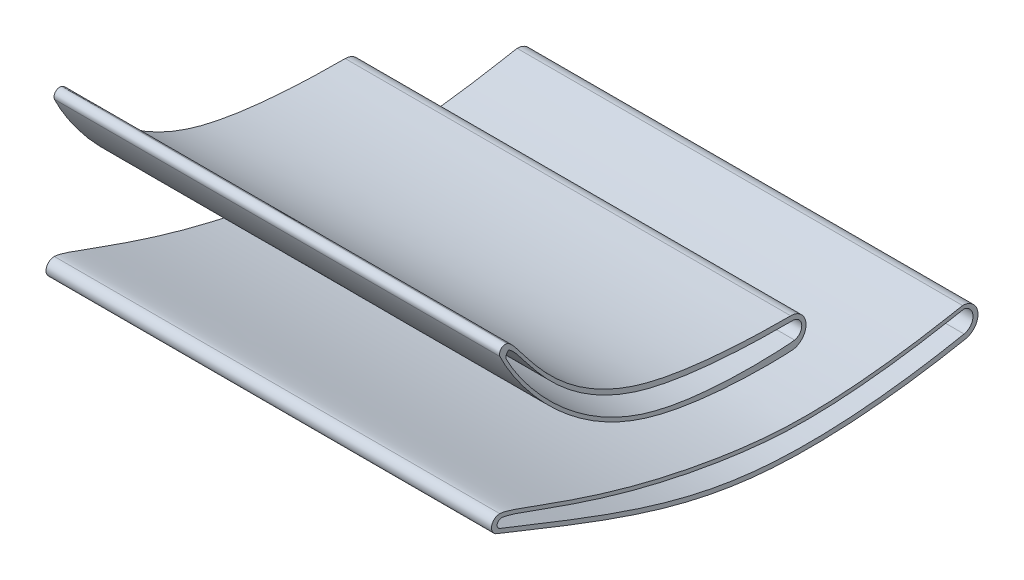
ISO-10303-21;
HEADER;
FILE_DESCRIPTION(('STEP AP214'),'2;1');
FILE_NAME('part.step','',(''),(''),'','','');
FILE_SCHEMA(('AUTOMOTIVE_DESIGN { 1 0 10303 214 1 1 1 1 }'));
ENDSEC;
DATA;
#1=APPLICATION_CONTEXT('core data for automotive mechanical design processes');
#2=APPLICATION_PROTOCOL_DEFINITION('international standard','automotive_design',2000,#1);
#3=PRODUCT_CONTEXT('',#1,'mechanical');
#4=PRODUCT('Part','Part','',(#3));
#5=PRODUCT_RELATED_PRODUCT_CATEGORY('part','',(#4));
#6=PRODUCT_DEFINITION_FORMATION('','',#4);
#7=PRODUCT_DEFINITION_CONTEXT('part definition',#1,'design');
#8=PRODUCT_DEFINITION('design','',#6,#7);
#9=PRODUCT_DEFINITION_SHAPE('','',#8);
#10=(LENGTH_UNIT() NAMED_UNIT(*) SI_UNIT(.MILLI.,.METRE.));
#11=(NAMED_UNIT(*) PLANE_ANGLE_UNIT() SI_UNIT($,.RADIAN.));
#12=(NAMED_UNIT(*) SI_UNIT($,.STERADIAN.) SOLID_ANGLE_UNIT());
#13=UNCERTAINTY_MEASURE_WITH_UNIT(LENGTH_MEASURE(1.E-05),#10,'distance_accuracy_value','');
#14=(GEOMETRIC_REPRESENTATION_CONTEXT(3) GLOBAL_UNCERTAINTY_ASSIGNED_CONTEXT((#13)) GLOBAL_UNIT_ASSIGNED_CONTEXT((#10,
#11,#12)) REPRESENTATION_CONTEXT('',''));
#15=CARTESIAN_POINT('',(0.,0.,0.));
#16=DIRECTION('',(0.,0.,1.));
#17=DIRECTION('',(1.,0.,0.));
#18=AXIS2_PLACEMENT_3D('',#15,#16,#17);
#19=CARTESIAN_POINT('',(10.,-324.281480067421,-30.));
#20=DIRECTION('',(1.,0.,0.));
#21=DIRECTION('',(0.,0.,-1.));
#22=AXIS2_PLACEMENT_3D('',#19,#20,#21);
#23=PLANE('',#22);
#24=CARTESIAN_POINT('',(10.,-273.992815703906,-545.318477571497));
#25=DIRECTION('',(1.,0.,0.));
#26=DIRECTION('',(0.,0.,-1.));
#27=AXIS2_PLACEMENT_3D('',#24,#25,#26);
#28=CIRCLE('',#27,12.4314574624245);
#29=CARTESIAN_POINT('',(10.,-286.183901531557,-547.751286849453));
#30=VERTEX_POINT('',#29);
#31=CARTESIAN_POINT('',(10.,-261.801729876255,-547.751286849453));
#32=VERTEX_POINT('',#31);
#33=EDGE_CURVE('E127',#30,#32,#28,.T.);
#34=ORIENTED_EDGE('',*,*,#33,.T.);
#35=CARTESIAN_POINT('',(10.,-261.801729876255,-547.751286849453));
#36=CARTESIAN_POINT('',(10.,-261.80878264872,-544.030343063351));
#37=CARTESIAN_POINT('',(10.,-290.65811541546,-416.625523478731));
#38=CARTESIAN_POINT('',(10.,-260.25694202219,-153.214077758844));
#39=CARTESIAN_POINT('',(10.,-205.629006110781,-47.7939068069425));
#40=CARTESIAN_POINT('',(10.,-205.31957005215,-28.631678276052));
#41=B_SPLINE_CURVE_WITH_KNOTS('',3,(#35,#36,#37,#38,#39,#40),.UNSPECIFIED.,.F.,.F.,(4,1,1,4),
(0.,0.339064775990525,0.439064775990525,1.),.UNSPECIFIED.);
#42=CARTESIAN_POINT('',(10.,-205.31957005215,-28.631678276052));
#43=VERTEX_POINT('',#42);
#44=EDGE_CURVE('E120',#32,#43,#41,.T.);
#45=ORIENTED_EDGE('',*,*,#44,.T.);
#46=CARTESIAN_POINT('',(10.,-210.18026564558,-28.5531866494537));
#47=DIRECTION('',(1.,0.,0.));
#48=DIRECTION('',(0.,0.,-1.));
#49=AXIS2_PLACEMENT_3D('',#46,#47,#48);
#50=CIRCLE('',#49,4.86132930250931);
#51=CARTESIAN_POINT('',(10.,-214.797807404622,-27.0330449814074));
#52=VERTEX_POINT('',#51);
#53=EDGE_CURVE('E130',#43,#52,#50,.T.);
#54=ORIENTED_EDGE('',*,*,#53,.T.);
#55=CARTESIAN_POINT('',(10.,-214.797807404622,-27.0330449814073));
#56=CARTESIAN_POINT('',(10.,-261.916580998264,-145.772718683601));
#57=CARTESIAN_POINT('',(10.,-319.373780693493,-285.975450577485));
#58=CARTESIAN_POINT('',(10.,-300.921699774301,-473.898492503466));
#59=CARTESIAN_POINT('',(10.,-286.183901531557,-547.751286849453));
#60=B_SPLINE_CURVE_WITH_KNOTS('',3,(#55,#56,#57,#58,#59),.UNSPECIFIED.,.F.,.F.,(4,1,4),(0.,
0.576111685978495,1.),.UNSPECIFIED.);
#61=EDGE_CURVE('E69',#52,#30,#60,.T.);
#62=ORIENTED_EDGE('',*,*,#61,.T.);
#63=EDGE_LOOP('',(#34,#45,#54,#62));
#64=FACE_BOUND('',#63,.T.);
#65=CARTESIAN_POINT('',(10.,-209.495939813425,-26.5742309862116));
#66=DIRECTION('',(1.,0.,0.));
#67=DIRECTION('',(0.,0.,1.));
#68=AXIS2_PLACEMENT_3D('',#65,#66,#67);
#69=CIRCLE('',#68,9.17908827491534);
#70=CARTESIAN_POINT('',(10.,-200.318314743193,-26.7381200613058));
#71=VERTEX_POINT('',#70);
#72=CARTESIAN_POINT('',(10.,-218.017297736922,-23.1621757846725));
#73=VERTEX_POINT('',#72);
#74=EDGE_CURVE('E188',#71,#73,#69,.T.);
#75=ORIENTED_EDGE('',*,*,#74,.F.);
#76=CARTESIAN_POINT('',(10.,-257.731029978854,-546.154906268973));
#77=CARTESIAN_POINT('',(10.,-257.731725159021,-542.431128001592));
#78=CARTESIAN_POINT('',(10.,-286.385074175091,-414.880335600918));
#79=CARTESIAN_POINT('',(10.,-255.510398156368,-151.321073340182));
#80=CARTESIAN_POINT('',(10.,-200.660753586686,-45.9143544336099));
#81=CARTESIAN_POINT('',(10.,-200.318314743193,-26.7381200613058));
#82=B_SPLINE_CURVE_WITH_KNOTS('',3,(#76,#77,#78,#79,#80,#81),.UNSPECIFIED.,.F.,.F.,(4,1,1,4),
(0.,0.339064775990525,0.439064775990525,1.),.UNSPECIFIED.);
#83=CARTESIAN_POINT('',(10.,-257.731029978854,-546.154906268973));
#84=VERTEX_POINT('',#83);
#85=EDGE_CURVE('E193',#84,#71,#82,.T.);
#86=ORIENTED_EDGE('',*,*,#85,.F.);
#87=CARTESIAN_POINT('',(10.,-274.942255754465,-546.15811937726));
#88=DIRECTION('',(1.,0.,0.));
#89=DIRECTION('',(0.,0.,-1.));
#90=AXIS2_PLACEMENT_3D('',#87,#88,#89);
#91=CIRCLE('',#90,17.2112260755335);
#92=CARTESIAN_POINT('',(10.,-291.831036848789,-549.474047025916));
#93=VERTEX_POINT('',#92);
#94=EDGE_CURVE('E61',#93,#84,#91,.T.);
#95=ORIENTED_EDGE('',*,*,#94,.F.);
#96=CARTESIAN_POINT('',(10.,-218.017297736922,-23.1621757846725));
#97=CARTESIAN_POINT('',(10.,-266.034178467192,-143.080818041075));
#98=CARTESIAN_POINT('',(10.,-324.572171749127,-284.669923622883));
#99=CARTESIAN_POINT('',(10.,-306.502271197421,-474.750080898962));
#100=CARTESIAN_POINT('',(10.,-291.831036848789,-549.474047025916));
#101=B_SPLINE_CURVE_WITH_KNOTS('',3,(#96,#97,#98,#99,#100),.UNSPECIFIED.,.F.,.F.,(4,1,4),(0.,
0.576111685978495,1.),.UNSPECIFIED.);
#102=EDGE_CURVE('E12',#73,#93,#101,.T.);
#103=ORIENTED_EDGE('',*,*,#102,.F.);
#104=EDGE_LOOP('',(#75,#86,#95,#103));
#105=FACE_BOUND('',#104,.T.);
#106=ADVANCED_FACE('F49',(#64,#105),#23,.F.);
#107=CARTESIAN_POINT('',(510.,-274.942255754465,-546.15811937726));
#108=DIRECTION('',(-1.,0.,0.));
#109=DIRECTION('',(0.,0.,1.));
#110=AXIS2_PLACEMENT_3D('',#107,#108,#109);
#111=CYLINDRICAL_SURFACE('',#110,17.2112260755335);
#112=ORIENTED_EDGE('',*,*,#94,.T.);
#113=DIRECTION('',(-1.,0.,0.));
#114=VECTOR('',#113,1.);
#115=CARTESIAN_POINT('',(510.,-257.731029978854,-546.154906268973));
#116=LINE('',#115,#114);
#117=CARTESIAN_POINT('',(510.,-257.731029978854,-546.154906268973));
#118=VERTEX_POINT('',#117);
#119=EDGE_CURVE('E221',#118,#84,#116,.T.);
#120=ORIENTED_EDGE('',*,*,#119,.F.);
#121=CARTESIAN_POINT('',(510.,-274.942255754465,-546.15811937726));
#122=DIRECTION('',(1.,0.,0.));
#123=DIRECTION('',(0.,0.,-1.));
#124=AXIS2_PLACEMENT_3D('',#121,#122,#123);
#125=CIRCLE('',#124,17.2112260755335);
#126=CARTESIAN_POINT('',(510.,-291.831036848789,-549.474047025916));
#127=VERTEX_POINT('',#126);
#128=EDGE_CURVE('E178',#127,#118,#125,.T.);
#129=ORIENTED_EDGE('',*,*,#128,.F.);
#130=DIRECTION('',(-1.,0.,0.));
#131=VECTOR('',#130,1.);
#132=CARTESIAN_POINT('',(510.,-291.831036848789,-549.474047025916));
#133=LINE('',#132,#131);
#134=EDGE_CURVE('E223',#127,#93,#133,.T.);
#135=ORIENTED_EDGE('',*,*,#134,.T.);
#136=EDGE_LOOP('',(#112,#120,#129,#135));
#137=FACE_BOUND('',#136,.T.);
#138=ADVANCED_FACE('F157',(#137),#111,.T.);
#139=CARTESIAN_POINT('',(510.,-257.731029978854,-546.154906268973));
#140=CARTESIAN_POINT('',(510.,-257.731725159021,-542.431128001592));
#141=CARTESIAN_POINT('',(510.,-286.385074175091,-414.880335600918));
#142=CARTESIAN_POINT('',(510.,-255.510398156368,-151.321073340182));
#143=CARTESIAN_POINT('',(510.,-200.660753586686,-45.9143544336099));
#144=CARTESIAN_POINT('',(510.,-200.318314743193,-26.7381200613058));
#145=B_SPLINE_CURVE_WITH_KNOTS('',3,(#139,#140,#141,#142,#143,#144),.UNSPECIFIED.,.F.,.F.,(4,1,
1,4),(0.,0.339064775990525,0.439064775990525,1.),.UNSPECIFIED.);
#146=DIRECTION('',(-1.,0.,0.));
#147=VECTOR('',#146,1.);
#148=SURFACE_OF_LINEAR_EXTRUSION('',#145,#147);
#149=ORIENTED_EDGE('',*,*,#85,.T.);
#150=DIRECTION('',(-1.,0.,0.));
#151=VECTOR('',#150,1.);
#152=CARTESIAN_POINT('',(510.,-200.318314743193,-26.7381200613058));
#153=LINE('',#152,#151);
#154=CARTESIAN_POINT('',(510.,-200.318314743193,-26.7381200613058));
#155=VERTEX_POINT('',#154);
#156=EDGE_CURVE('E226',#155,#71,#153,.T.);
#157=ORIENTED_EDGE('',*,*,#156,.F.);
#158=EDGE_CURVE('E172',#118,#155,#145,.T.);
#159=ORIENTED_EDGE('',*,*,#158,.F.);
#160=ORIENTED_EDGE('',*,*,#119,.T.);
#161=EDGE_LOOP('',(#149,#157,#159,#160));
#162=FACE_BOUND('',#161,.T.);
#163=ADVANCED_FACE('F166',(#162),#148,.F.);
#164=CARTESIAN_POINT('',(510.,-303.462035884563,-284.326105547402));
#165=DIRECTION('',(1.,0.,0.));
#166=DIRECTION('',(0.,0.,-1.));
#167=AXIS2_PLACEMENT_3D('',#164,#165,#166);
#168=PLANE('',#167);
#169=CARTESIAN_POINT('',(510.,-261.801729876255,-547.751286849453));
#170=CARTESIAN_POINT('',(510.,-261.80878264872,-544.030343063351));
#171=CARTESIAN_POINT('',(510.,-290.65811541546,-416.625523478731));
#172=CARTESIAN_POINT('',(510.,-260.25694202219,-153.214077758844));
#173=CARTESIAN_POINT('',(510.,-205.629006110781,-47.7939068069425));
#174=CARTESIAN_POINT('',(510.,-205.31957005215,-28.631678276052));
#175=B_SPLINE_CURVE_WITH_KNOTS('',3,(#169,#170,#171,#172,#173,#174),.UNSPECIFIED.,.F.,.F.,(4,1,
1,4),(0.,0.339064775990525,0.439064775990525,1.),.UNSPECIFIED.);
#176=CARTESIAN_POINT('',(510.,-261.801729876255,-547.751286849453));
#177=VERTEX_POINT('',#176);
#178=CARTESIAN_POINT('',(510.,-205.31957005215,-28.631678276052));
#179=VERTEX_POINT('',#178);
#180=EDGE_CURVE('E77',#177,#179,#175,.T.);
#181=ORIENTED_EDGE('',*,*,#180,.F.);
#182=CARTESIAN_POINT('',(510.,-273.992815703906,-545.318477571497));
#183=DIRECTION('',(1.,0.,0.));
#184=DIRECTION('',(0.,0.,-1.));
#185=AXIS2_PLACEMENT_3D('',#182,#183,#184);
#186=CIRCLE('',#185,12.4314574624245);
#187=CARTESIAN_POINT('',(510.,-286.183901531557,-547.751286849453));
#188=VERTEX_POINT('',#187);
#189=EDGE_CURVE('E138',#188,#177,#186,.T.);
#190=ORIENTED_EDGE('',*,*,#189,.F.);
#191=CARTESIAN_POINT('',(510.,-214.797807404622,-27.0330449814073));
#192=CARTESIAN_POINT('',(510.,-261.916580998264,-145.772718683601));
#193=CARTESIAN_POINT('',(510.,-319.373780693493,-285.975450577485));
#194=CARTESIAN_POINT('',(510.,-300.921699774301,-473.898492503466));
#195=CARTESIAN_POINT('',(510.,-286.183901531557,-547.751286849453));
#196=B_SPLINE_CURVE_WITH_KNOTS('',3,(#191,#192,#193,#194,#195),.UNSPECIFIED.,.F.,.F.,(4,1,4),
(0.,0.576111685978495,1.),.UNSPECIFIED.);
#197=CARTESIAN_POINT('',(510.,-214.797807404622,-27.0330449814074));
#198=VERTEX_POINT('',#197);
#199=EDGE_CURVE('E142',#198,#188,#196,.T.);
#200=ORIENTED_EDGE('',*,*,#199,.F.);
#201=CARTESIAN_POINT('',(510.,-210.18026564558,-28.5531866494537));
#202=DIRECTION('',(1.,0.,0.));
#203=DIRECTION('',(0.,0.,-1.));
#204=AXIS2_PLACEMENT_3D('',#201,#202,#203);
#205=CIRCLE('',#204,4.86132930250931);
#206=EDGE_CURVE('E245',#179,#198,#205,.T.);
#207=ORIENTED_EDGE('',*,*,#206,.F.);
#208=EDGE_LOOP('',(#181,#190,#200,#207));
#209=FACE_BOUND('',#208,.T.);
#210=CARTESIAN_POINT('',(510.,-218.017297736922,-23.1621757846725));
#211=CARTESIAN_POINT('',(510.,-266.034178467192,-143.080818041075));
#212=CARTESIAN_POINT('',(510.,-324.572171749127,-284.669923622883));
#213=CARTESIAN_POINT('',(510.,-306.502271197421,-474.750080898962));
#214=CARTESIAN_POINT('',(510.,-291.831036848789,-549.474047025916));
#215=B_SPLINE_CURVE_WITH_KNOTS('',3,(#210,#211,#212,#213,#214),.UNSPECIFIED.,.F.,.F.,(4,1,4),
(0.,0.576111685978495,1.),.UNSPECIFIED.);
#216=CARTESIAN_POINT('',(510.,-218.017297736922,-23.1621757846725));
#217=VERTEX_POINT('',#216);
#218=EDGE_CURVE('E52',#217,#127,#215,.T.);
#219=ORIENTED_EDGE('',*,*,#218,.T.);
#220=ORIENTED_EDGE('',*,*,#128,.T.);
#221=ORIENTED_EDGE('',*,*,#158,.T.);
#222=CARTESIAN_POINT('',(510.,-209.495939813425,-26.5742309862116));
#223=DIRECTION('',(1.,0.,0.));
#224=DIRECTION('',(0.,0.,1.));
#225=AXIS2_PLACEMENT_3D('',#222,#223,#224);
#226=CIRCLE('',#225,9.17908827491534);
#227=EDGE_CURVE('E179',#155,#217,#226,.T.);
#228=ORIENTED_EDGE('',*,*,#227,.T.);
#229=EDGE_LOOP('',(#219,#220,#221,#228));
#230=FACE_BOUND('',#229,.T.);
#231=ADVANCED_FACE('F162',(#209,#230),#168,.T.);
#232=DIRECTION('',(-1.,0.,0.));
#233=VECTOR('',#232,1.);
#234=SURFACE_OF_LINEAR_EXTRUSION('',#215,#233);
#235=ORIENTED_EDGE('',*,*,#102,.T.);
#236=ORIENTED_EDGE('',*,*,#134,.F.);
#237=ORIENTED_EDGE('',*,*,#218,.F.);
#238=DIRECTION('',(-1.,0.,0.));
#239=VECTOR('',#238,1.);
#240=CARTESIAN_POINT('',(510.,-218.017297736922,-23.1621757846725));
#241=LINE('',#240,#239);
#242=EDGE_CURVE('E203',#217,#73,#241,.T.);
#243=ORIENTED_EDGE('',*,*,#242,.T.);
#244=EDGE_LOOP('',(#235,#236,#237,#243));
#245=FACE_BOUND('',#244,.T.);
#246=ADVANCED_FACE('F159',(#245),#234,.F.);
#247=CARTESIAN_POINT('',(510.,-209.495939813425,-26.5742309862116));
#248=DIRECTION('',(-1.,0.,0.));
#249=DIRECTION('',(0.,0.,1.));
#250=AXIS2_PLACEMENT_3D('',#247,#248,#249);
#251=CYLINDRICAL_SURFACE('',#250,9.17908827491534);
#252=ORIENTED_EDGE('',*,*,#74,.T.);
#253=ORIENTED_EDGE('',*,*,#242,.F.);
#254=ORIENTED_EDGE('',*,*,#227,.F.);
#255=ORIENTED_EDGE('',*,*,#156,.T.);
#256=EDGE_LOOP('',(#252,#253,#254,#255));
#257=FACE_BOUND('',#256,.T.);
#258=ADVANCED_FACE('F156',(#257),#251,.T.);
#259=DIRECTION('',(1.,0.,0.));
#260=VECTOR('',#259,1.);
#261=SURFACE_OF_LINEAR_EXTRUSION('',#41,#260);
#262=ORIENTED_EDGE('',*,*,#180,.T.);
#263=DIRECTION('',(1.,0.,0.));
#264=VECTOR('',#263,1.);
#265=CARTESIAN_POINT('',(10.,-205.31957005215,-28.631678276052));
#266=LINE('',#265,#264);
#267=EDGE_CURVE('E116',#43,#179,#266,.T.);
#268=ORIENTED_EDGE('',*,*,#267,.F.);
#269=ORIENTED_EDGE('',*,*,#44,.F.);
#270=DIRECTION('',(1.,0.,0.));
#271=VECTOR('',#270,1.);
#272=CARTESIAN_POINT('',(10.,-261.801729876255,-547.751286849453));
#273=LINE('',#272,#271);
#274=EDGE_CURVE('E230',#32,#177,#273,.T.);
#275=ORIENTED_EDGE('',*,*,#274,.T.);
#276=EDGE_LOOP('',(#262,#268,#269,#275));
#277=FACE_BOUND('',#276,.T.);
#278=ADVANCED_FACE('F118',(#277),#261,.F.);
#279=CARTESIAN_POINT('',(10.,-273.992815703906,-545.318477571497));
#280=DIRECTION('',(1.,0.,0.));
#281=DIRECTION('',(0.,0.,-1.));
#282=AXIS2_PLACEMENT_3D('',#279,#280,#281);
#283=CYLINDRICAL_SURFACE('',#282,12.4314574624245);
#284=ORIENTED_EDGE('',*,*,#189,.T.);
#285=ORIENTED_EDGE('',*,*,#274,.F.);
#286=ORIENTED_EDGE('',*,*,#33,.F.);
#287=DIRECTION('',(1.,0.,0.));
#288=VECTOR('',#287,1.);
#289=CARTESIAN_POINT('',(10.,-286.183901531557,-547.751286849453));
#290=LINE('',#289,#288);
#291=EDGE_CURVE('E235',#30,#188,#290,.T.);
#292=ORIENTED_EDGE('',*,*,#291,.T.);
#293=EDGE_LOOP('',(#284,#285,#286,#292));
#294=FACE_BOUND('',#293,.T.);
#295=ADVANCED_FACE('F155',(#294),#283,.F.);
#296=DIRECTION('',(1.,0.,0.));
#297=VECTOR('',#296,1.);
#298=SURFACE_OF_LINEAR_EXTRUSION('',#60,#297);
#299=ORIENTED_EDGE('',*,*,#199,.T.);
#300=ORIENTED_EDGE('',*,*,#291,.F.);
#301=ORIENTED_EDGE('',*,*,#61,.F.);
#302=DIRECTION('',(1.,0.,0.));
#303=VECTOR('',#302,1.);
#304=CARTESIAN_POINT('',(10.,-214.797807404622,-27.0330449814074));
#305=LINE('',#304,#303);
#306=EDGE_CURVE('E126',#52,#198,#305,.T.);
#307=ORIENTED_EDGE('',*,*,#306,.T.);
#308=EDGE_LOOP('',(#299,#300,#301,#307));
#309=FACE_BOUND('',#308,.T.);
#310=ADVANCED_FACE('F266',(#309),#298,.F.);
#311=CARTESIAN_POINT('',(10.,-210.18026564558,-28.5531866494537));
#312=DIRECTION('',(1.,0.,0.));
#313=DIRECTION('',(0.,0.,-1.));
#314=AXIS2_PLACEMENT_3D('',#311,#312,#313);
#315=CYLINDRICAL_SURFACE('',#314,4.86132930250931);
#316=ORIENTED_EDGE('',*,*,#206,.T.);
#317=ORIENTED_EDGE('',*,*,#306,.F.);
#318=ORIENTED_EDGE('',*,*,#53,.F.);
#319=ORIENTED_EDGE('',*,*,#267,.T.);
#320=EDGE_LOOP('',(#316,#317,#318,#319));
#321=FACE_BOUND('',#320,.T.);
#322=ADVANCED_FACE('F131',(#321),#315,.F.);
#323=CLOSED_SHELL('',(#106,#138,#163,#231,#246,#258,#278,#295,#310,#322));
#324=MANIFOLD_SOLID_BREP('B2',#323);
#325=CARTESIAN_POINT('',(10.,-324.281480067421,-30.));
#326=DIRECTION('',(1.,0.,0.));
#327=DIRECTION('',(0.,0.,-1.));
#328=AXIS2_PLACEMENT_3D('',#325,#326,#327);
#329=PLANE('',#328);
#330=CARTESIAN_POINT('',(10.,-187.081026191342,-355.396765263693));
#331=DIRECTION('',(1.,0.,0.));
#332=DIRECTION('',(0.,0.,-1.));
#333=AXIS2_PLACEMENT_3D('',#330,#331,#332);
#334=CIRCLE('',#333,10.1691094199311);
#335=CARTESIAN_POINT('',(10.,-197.01726371846,-357.560551343514));
#336=VERTEX_POINT('',#335);
#337=CARTESIAN_POINT('',(10.,-176.913606660255,-355.211383297452));
#338=VERTEX_POINT('',#337);
#339=EDGE_CURVE('E419',#336,#338,#334,.T.);
#340=ORIENTED_EDGE('',*,*,#339,.T.);
#341=CARTESIAN_POINT('',(10.,-176.913606660255,-355.211383297452));
#342=CARTESIAN_POINT('',(10.,-177.014474155505,-333.266088602775));
#343=CARTESIAN_POINT('',(10.,-177.561646330886,-101.084686466288));
#344=CARTESIAN_POINT('',(10.,-52.2461616606398,-52.06866743236));
#345=CARTESIAN_POINT('',(10.,-46.3492648686673,-36.5633682554917));
#346=B_SPLINE_CURVE_WITH_KNOTS('',3,(#341,#342,#343,#344,#345),.UNSPECIFIED.,.F.,.F.,(4,1,4),
(0.,0.360804402812459,1.),.UNSPECIFIED.);
#347=CARTESIAN_POINT('',(10.,-46.3492648686673,-36.5633682554917));
#348=VERTEX_POINT('',#347);
#349=EDGE_CURVE('E413',#338,#348,#346,.T.);
#350=ORIENTED_EDGE('',*,*,#349,.T.);
#351=CARTESIAN_POINT('',(10.,-51.5716239260615,-39.6995143879519));
#352=DIRECTION('',(1.,0.,0.));
#353=DIRECTION('',(0.,0.,-1.));
#354=AXIS2_PLACEMENT_3D('',#351,#352,#353);
#355=CIRCLE('',#354,6.09167027082818);
#356=CARTESIAN_POINT('',(10.,-54.2051650335435,-34.2065272294293));
#357=VERTEX_POINT('',#356);
#358=EDGE_CURVE('E422',#348,#357,#355,.T.);
#359=ORIENTED_EDGE('',*,*,#358,.T.);
#360=CARTESIAN_POINT('',(10.,-54.2051650335435,-34.2065272294293));
#361=CARTESIAN_POINT('',(10.,-72.2413232922094,-42.8537282558419));
#362=CARTESIAN_POINT('',(10.,-216.180799121949,-130.601266659924));
#363=CARTESIAN_POINT('',(10.,-197.746703186497,-354.210920858472));
#364=CARTESIAN_POINT('',(10.,-197.01726371846,-357.560551343514));
#365=B_SPLINE_CURVE_WITH_KNOTS('',3,(#360,#361,#362,#363,#364),.UNSPECIFIED.,.F.,.F.,(4,1,4),
(0.,0.590315330441631,1.),.UNSPECIFIED.);
#366=EDGE_CURVE('E361',#357,#336,#365,.T.);
#367=ORIENTED_EDGE('',*,*,#366,.T.);
#368=EDGE_LOOP('',(#340,#350,#359,#367));
#369=FACE_BOUND('',#368,.T.);
#370=CARTESIAN_POINT('',(10.,-188.394419043439,-353.169539728973));
#371=DIRECTION('',(1.,0.,0.));
#372=DIRECTION('',(0.,0.,-1.));
#373=AXIS2_PLACEMENT_3D('',#370,#371,#372);
#374=CIRCLE('',#373,17.2126847464395);
#375=CARTESIAN_POINT('',(10.,-205.316311304832,-356.320107689534));
#376=VERTEX_POINT('',#375);
#377=CARTESIAN_POINT('',(10.,-171.181734297002,-353.169530365349));
#378=VERTEX_POINT('',#377);
#379=EDGE_CURVE('E489',#376,#378,#374,.T.);
#380=ORIENTED_EDGE('',*,*,#379,.F.);
#381=CARTESIAN_POINT('',(10.,-47.7372149956287,-26.9501856712703));
#382=CARTESIAN_POINT('',(10.,-66.6295550857602,-35.3127262433403));
#383=CARTESIAN_POINT('',(10.,-217.989087479131,-121.396454164475));
#384=CARTESIAN_POINT('',(10.,-205.964445920581,-352.838937222535));
#385=CARTESIAN_POINT('',(10.,-205.316311304833,-356.320107689534));
#386=B_SPLINE_CURVE_WITH_KNOTS('',3,(#381,#382,#383,#384,#385),.UNSPECIFIED.,.F.,.F.,(4,1,4),
(0.,0.590315330441631,1.),.UNSPECIFIED.);
#387=CARTESIAN_POINT('',(10.,-47.7372149956287,-26.9501856712703));
#388=VERTEX_POINT('',#387);
#389=EDGE_CURVE('E485',#388,#376,#386,.T.);
#390=ORIENTED_EDGE('',*,*,#389,.F.);
#391=CARTESIAN_POINT('',(10.,-45.1404123394199,-32.8167854808913));
#392=DIRECTION('',(1.,0.,0.));
#393=DIRECTION('',(0.,0.,1.));
#394=AXIS2_PLACEMENT_3D('',#391,#392,#393);
#395=CIRCLE('',#394,6.41563538252756);
#396=CARTESIAN_POINT('',(10.,-39.1543533593346,-35.1249178966076));
#397=VERTEX_POINT('',#396);
#398=EDGE_CURVE('E479',#397,#388,#395,.T.);
#399=ORIENTED_EDGE('',*,*,#398,.F.);
#400=CARTESIAN_POINT('',(10.,-171.181734297002,-353.169530365349));
#401=CARTESIAN_POINT('',(10.,-171.181746235272,-331.224003862466));
#402=CARTESIAN_POINT('',(10.,-170.661871262547,-99.0425390004754));
#403=CARTESIAN_POINT('',(10.,-45.1224459351378,-50.6029528282735));
#404=CARTESIAN_POINT('',(10.,-39.1543533593346,-35.1249178966076));
#405=B_SPLINE_CURVE_WITH_KNOTS('',3,(#400,#401,#402,#403,#404),.UNSPECIFIED.,.F.,.F.,(4,1,4),
(0.,0.360804402812459,1.),.UNSPECIFIED.);
#406=EDGE_CURVE('E475',#378,#397,#405,.T.);
#407=ORIENTED_EDGE('',*,*,#406,.F.);
#408=EDGE_LOOP('',(#380,#390,#399,#407));
#409=FACE_BOUND('',#408,.T.);
#410=ADVANCED_FACE('F347',(#369,#409),#329,.F.);
#411=CARTESIAN_POINT('',(510.,-45.1404123394199,-32.8167854808913));
#412=DIRECTION('',(-1.,0.,0.));
#413=DIRECTION('',(0.,0.,1.));
#414=AXIS2_PLACEMENT_3D('',#411,#412,#413);
#415=CYLINDRICAL_SURFACE('',#414,6.41563538252756);
#416=ORIENTED_EDGE('',*,*,#398,.T.);
#417=DIRECTION('',(-1.,0.,0.));
#418=VECTOR('',#417,1.);
#419=CARTESIAN_POINT('',(510.,-47.7372149956287,-26.9501856712703));
#420=LINE('',#419,#418);
#421=CARTESIAN_POINT('',(510.,-47.7372149956287,-26.9501856712703));
#422=VERTEX_POINT('',#421);
#423=EDGE_CURVE('E354',#422,#388,#420,.T.);
#424=ORIENTED_EDGE('',*,*,#423,.F.);
#425=CARTESIAN_POINT('',(510.,-45.1404123394199,-32.8167854808913));
#426=DIRECTION('',(1.,0.,0.));
#427=DIRECTION('',(0.,0.,1.));
#428=AXIS2_PLACEMENT_3D('',#425,#426,#427);
#429=CIRCLE('',#428,6.41563538252756);
#430=CARTESIAN_POINT('',(510.,-39.1543533593346,-35.1249178966076));
#431=VERTEX_POINT('',#430);
#432=EDGE_CURVE('E468',#431,#422,#429,.T.);
#433=ORIENTED_EDGE('',*,*,#432,.F.);
#434=DIRECTION('',(-1.,0.,0.));
#435=VECTOR('',#434,1.);
#436=CARTESIAN_POINT('',(510.,-39.1543533593346,-35.1249178966076));
#437=LINE('',#436,#435);
#438=EDGE_CURVE('E47',#431,#397,#437,.T.);
#439=ORIENTED_EDGE('',*,*,#438,.T.);
#440=EDGE_LOOP('',(#416,#424,#433,#439));
#441=FACE_BOUND('',#440,.T.);
#442=ADVANCED_FACE('F446',(#441),#415,.T.);
#443=CARTESIAN_POINT('',(510.,-47.7372149956287,-26.9501856712703));
#444=CARTESIAN_POINT('',(510.,-66.6295550857602,-35.3127262433403));
#445=CARTESIAN_POINT('',(510.,-217.989087479131,-121.396454164475));
#446=CARTESIAN_POINT('',(510.,-205.964445920581,-352.838937222535));
#447=CARTESIAN_POINT('',(510.,-205.316311304833,-356.320107689534));
#448=B_SPLINE_CURVE_WITH_KNOTS('',3,(#443,#444,#445,#446,#447),.UNSPECIFIED.,.F.,.F.,(4,1,4),
(0.,0.590315330441631,1.),.UNSPECIFIED.);
#449=DIRECTION('',(-1.,0.,0.));
#450=VECTOR('',#449,1.);
#451=SURFACE_OF_LINEAR_EXTRUSION('',#448,#450);
#452=ORIENTED_EDGE('',*,*,#389,.T.);
#453=DIRECTION('',(-1.,0.,0.));
#454=VECTOR('',#453,1.);
#455=CARTESIAN_POINT('',(510.,-205.316311304833,-356.320107689534));
#456=LINE('',#455,#454);
#457=CARTESIAN_POINT('',(510.,-205.316311304833,-356.320107689534));
#458=VERTEX_POINT('',#457);
#459=EDGE_CURVE('E498',#458,#376,#456,.T.);
#460=ORIENTED_EDGE('',*,*,#459,.F.);
#461=EDGE_CURVE('E461',#422,#458,#448,.T.);
#462=ORIENTED_EDGE('',*,*,#461,.F.);
#463=ORIENTED_EDGE('',*,*,#423,.T.);
#464=EDGE_LOOP('',(#452,#460,#462,#463));
#465=FACE_BOUND('',#464,.T.);
#466=ADVANCED_FACE('F452',(#465),#451,.F.);
#467=CARTESIAN_POINT('',(510.,-129.505777713154,-128.392117156116));
#468=DIRECTION('',(1.,0.,0.));
#469=DIRECTION('',(0.,0.,-1.));
#470=AXIS2_PLACEMENT_3D('',#467,#468,#469);
#471=PLANE('',#470);
#472=CARTESIAN_POINT('',(510.,-176.913606660255,-355.211383297452));
#473=CARTESIAN_POINT('',(510.,-177.014474155505,-333.266088602775));
#474=CARTESIAN_POINT('',(510.,-177.561646330886,-101.084686466288));
#475=CARTESIAN_POINT('',(510.,-52.2461616606398,-52.06866743236));
#476=CARTESIAN_POINT('',(510.,-46.3492648686673,-36.5633682554917));
#477=B_SPLINE_CURVE_WITH_KNOTS('',3,(#472,#473,#474,#475,#476),.UNSPECIFIED.,.F.,.F.,(4,1,4),
(0.,0.360804402812459,1.),.UNSPECIFIED.);
#478=CARTESIAN_POINT('',(510.,-176.913606660255,-355.211383297452));
#479=VERTEX_POINT('',#478);
#480=CARTESIAN_POINT('',(510.,-46.3492648686673,-36.5633682554917));
#481=VERTEX_POINT('',#480);
#482=EDGE_CURVE('E369',#479,#481,#477,.T.);
#483=ORIENTED_EDGE('',*,*,#482,.F.);
#484=CARTESIAN_POINT('',(510.,-187.081026191342,-355.396765263693));
#485=DIRECTION('',(1.,0.,0.));
#486=DIRECTION('',(0.,0.,-1.));
#487=AXIS2_PLACEMENT_3D('',#484,#485,#486);
#488=CIRCLE('',#487,10.1691094199311);
#489=CARTESIAN_POINT('',(510.,-197.01726371846,-357.560551343514));
#490=VERTEX_POINT('',#489);
#491=EDGE_CURVE('E428',#490,#479,#488,.T.);
#492=ORIENTED_EDGE('',*,*,#491,.F.);
#493=CARTESIAN_POINT('',(510.,-54.2051650335435,-34.2065272294293));
#494=CARTESIAN_POINT('',(510.,-72.2413232922094,-42.8537282558419));
#495=CARTESIAN_POINT('',(510.,-216.180799121949,-130.601266659924));
#496=CARTESIAN_POINT('',(510.,-197.746703186497,-354.210920858472));
#497=CARTESIAN_POINT('',(510.,-197.01726371846,-357.560551343514));
#498=B_SPLINE_CURVE_WITH_KNOTS('',3,(#493,#494,#495,#496,#497),.UNSPECIFIED.,.F.,.F.,(4,1,4),
(0.,0.590315330441631,1.),.UNSPECIFIED.);
#499=CARTESIAN_POINT('',(510.,-54.2051650335435,-34.2065272294293));
#500=VERTEX_POINT('',#499);
#501=EDGE_CURVE('E431',#500,#490,#498,.T.);
#502=ORIENTED_EDGE('',*,*,#501,.F.);
#503=CARTESIAN_POINT('',(510.,-51.5716239260615,-39.6995143879519));
#504=DIRECTION('',(1.,0.,0.));
#505=DIRECTION('',(0.,0.,-1.));
#506=AXIS2_PLACEMENT_3D('',#503,#504,#505);
#507=CIRCLE('',#506,6.09167027082818);
#508=EDGE_CURVE('E589',#481,#500,#507,.T.);
#509=ORIENTED_EDGE('',*,*,#508,.F.);
#510=EDGE_LOOP('',(#483,#492,#502,#509));
#511=FACE_BOUND('',#510,.T.);
#512=CARTESIAN_POINT('',(510.,-171.181734297002,-353.169530365349));
#513=CARTESIAN_POINT('',(510.,-171.181746235272,-331.224003862466));
#514=CARTESIAN_POINT('',(510.,-170.661871262547,-99.0425390004754));
#515=CARTESIAN_POINT('',(510.,-45.1224459351378,-50.6029528282735));
#516=CARTESIAN_POINT('',(510.,-39.1543533593346,-35.1249178966076));
#517=B_SPLINE_CURVE_WITH_KNOTS('',3,(#512,#513,#514,#515,#516),.UNSPECIFIED.,.F.,.F.,(4,1,4),
(0.,0.360804402812459,1.),.UNSPECIFIED.);
#518=CARTESIAN_POINT('',(510.,-171.181734297002,-353.169530365349));
#519=VERTEX_POINT('',#518);
#520=EDGE_CURVE('E495',#519,#431,#517,.T.);
#521=ORIENTED_EDGE('',*,*,#520,.T.);
#522=ORIENTED_EDGE('',*,*,#432,.T.);
#523=ORIENTED_EDGE('',*,*,#461,.T.);
#524=CARTESIAN_POINT('',(510.,-188.394419043439,-353.169539728973));
#525=DIRECTION('',(1.,0.,0.));
#526=DIRECTION('',(0.,0.,-1.));
#527=AXIS2_PLACEMENT_3D('',#524,#525,#526);
#528=CIRCLE('',#527,17.2126847464395);
#529=EDGE_CURVE('E467',#458,#519,#528,.T.);
#530=ORIENTED_EDGE('',*,*,#529,.T.);
#531=EDGE_LOOP('',(#521,#522,#523,#530));
#532=FACE_BOUND('',#531,.T.);
#533=ADVANCED_FACE('F448',(#511,#532),#471,.T.);
#534=DIRECTION('',(-1.,0.,0.));
#535=VECTOR('',#534,1.);
#536=SURFACE_OF_LINEAR_EXTRUSION('',#517,#535);
#537=ORIENTED_EDGE('',*,*,#406,.T.);
#538=ORIENTED_EDGE('',*,*,#438,.F.);
#539=ORIENTED_EDGE('',*,*,#520,.F.);
#540=DIRECTION('',(-1.,0.,0.));
#541=VECTOR('',#540,1.);
#542=CARTESIAN_POINT('',(510.,-171.181734297002,-353.169530365349));
#543=LINE('',#542,#541);
#544=EDGE_CURVE('E474',#519,#378,#543,.T.);
#545=ORIENTED_EDGE('',*,*,#544,.T.);
#546=EDGE_LOOP('',(#537,#538,#539,#545));
#547=FACE_BOUND('',#546,.T.);
#548=ADVANCED_FACE('F451',(#547),#536,.F.);
#549=CARTESIAN_POINT('',(510.,-188.394419043439,-353.169539728973));
#550=DIRECTION('',(-1.,0.,0.));
#551=DIRECTION('',(0.,0.,1.));
#552=AXIS2_PLACEMENT_3D('',#549,#550,#551);
#553=CYLINDRICAL_SURFACE('',#552,17.2126847464395);
#554=ORIENTED_EDGE('',*,*,#379,.T.);
#555=ORIENTED_EDGE('',*,*,#544,.F.);
#556=ORIENTED_EDGE('',*,*,#529,.F.);
#557=ORIENTED_EDGE('',*,*,#459,.T.);
#558=EDGE_LOOP('',(#554,#555,#556,#557));
#559=FACE_BOUND('',#558,.T.);
#560=ADVANCED_FACE('F445',(#559),#553,.T.);
#561=DIRECTION('',(1.,0.,0.));
#562=VECTOR('',#561,1.);
#563=SURFACE_OF_LINEAR_EXTRUSION('',#346,#562);
#564=ORIENTED_EDGE('',*,*,#482,.T.);
#565=DIRECTION('',(1.,0.,0.));
#566=VECTOR('',#565,1.);
#567=CARTESIAN_POINT('',(10.,-46.3492648686673,-36.5633682554917));
#568=LINE('',#567,#566);
#569=EDGE_CURVE('E409',#348,#481,#568,.T.);
#570=ORIENTED_EDGE('',*,*,#569,.F.);
#571=ORIENTED_EDGE('',*,*,#349,.F.);
#572=DIRECTION('',(1.,0.,0.));
#573=VECTOR('',#572,1.);
#574=CARTESIAN_POINT('',(10.,-176.913606660255,-355.211383297452));
#575=LINE('',#574,#573);
#576=EDGE_CURVE('E480',#338,#479,#575,.T.);
#577=ORIENTED_EDGE('',*,*,#576,.T.);
#578=EDGE_LOOP('',(#564,#570,#571,#577));
#579=FACE_BOUND('',#578,.T.);
#580=ADVANCED_FACE('F411',(#579),#563,.F.);
#581=CARTESIAN_POINT('',(10.,-187.081026191342,-355.396765263693));
#582=DIRECTION('',(1.,0.,0.));
#583=DIRECTION('',(0.,0.,-1.));
#584=AXIS2_PLACEMENT_3D('',#581,#582,#583);
#585=CYLINDRICAL_SURFACE('',#584,10.1691094199311);
#586=ORIENTED_EDGE('',*,*,#491,.T.);
#587=ORIENTED_EDGE('',*,*,#576,.F.);
#588=ORIENTED_EDGE('',*,*,#339,.F.);
#589=DIRECTION('',(1.,0.,0.));
#590=VECTOR('',#589,1.);
#591=CARTESIAN_POINT('',(10.,-197.01726371846,-357.560551343514));
#592=LINE('',#591,#590);
#593=EDGE_CURVE('E601',#336,#490,#592,.T.);
#594=ORIENTED_EDGE('',*,*,#593,.T.);
#595=EDGE_LOOP('',(#586,#587,#588,#594));
#596=FACE_BOUND('',#595,.T.);
#597=ADVANCED_FACE('F444',(#596),#585,.F.);
#598=DIRECTION('',(1.,0.,0.));
#599=VECTOR('',#598,1.);
#600=SURFACE_OF_LINEAR_EXTRUSION('',#365,#599);
#601=ORIENTED_EDGE('',*,*,#501,.T.);
#602=ORIENTED_EDGE('',*,*,#593,.F.);
#603=ORIENTED_EDGE('',*,*,#366,.F.);
#604=DIRECTION('',(1.,0.,0.));
#605=VECTOR('',#604,1.);
#606=CARTESIAN_POINT('',(10.,-54.2051650335435,-34.2065272294293));
#607=LINE('',#606,#605);
#608=EDGE_CURVE('E418',#357,#500,#607,.T.);
#609=ORIENTED_EDGE('',*,*,#608,.T.);
#610=EDGE_LOOP('',(#601,#602,#603,#609));
#611=FACE_BOUND('',#610,.T.);
#612=ADVANCED_FACE('F558',(#611),#600,.F.);
#613=CARTESIAN_POINT('',(10.,-51.5716239260615,-39.6995143879519));
#614=DIRECTION('',(1.,0.,0.));
#615=DIRECTION('',(0.,0.,-1.));
#616=AXIS2_PLACEMENT_3D('',#613,#614,#615);
#617=CYLINDRICAL_SURFACE('',#616,6.09167027082818);
#618=ORIENTED_EDGE('',*,*,#508,.T.);
#619=ORIENTED_EDGE('',*,*,#608,.F.);
#620=ORIENTED_EDGE('',*,*,#358,.F.);
#621=ORIENTED_EDGE('',*,*,#569,.T.);
#622=EDGE_LOOP('',(#618,#619,#620,#621));
#623=FACE_BOUND('',#622,.T.);
#624=ADVANCED_FACE('F423',(#623),#617,.F.);
#625=CLOSED_SHELL('',(#410,#442,#466,#533,#548,#560,#580,#597,#612,#624));
#626=MANIFOLD_SOLID_BREP('B6',#625);
#627=ADVANCED_BREP_SHAPE_REPRESENTATION('',(#18,#324,#626),#14);
#628=SHAPE_DEFINITION_REPRESENTATION(#9,#627);
ENDSEC;
END-ISO-10303-21;
